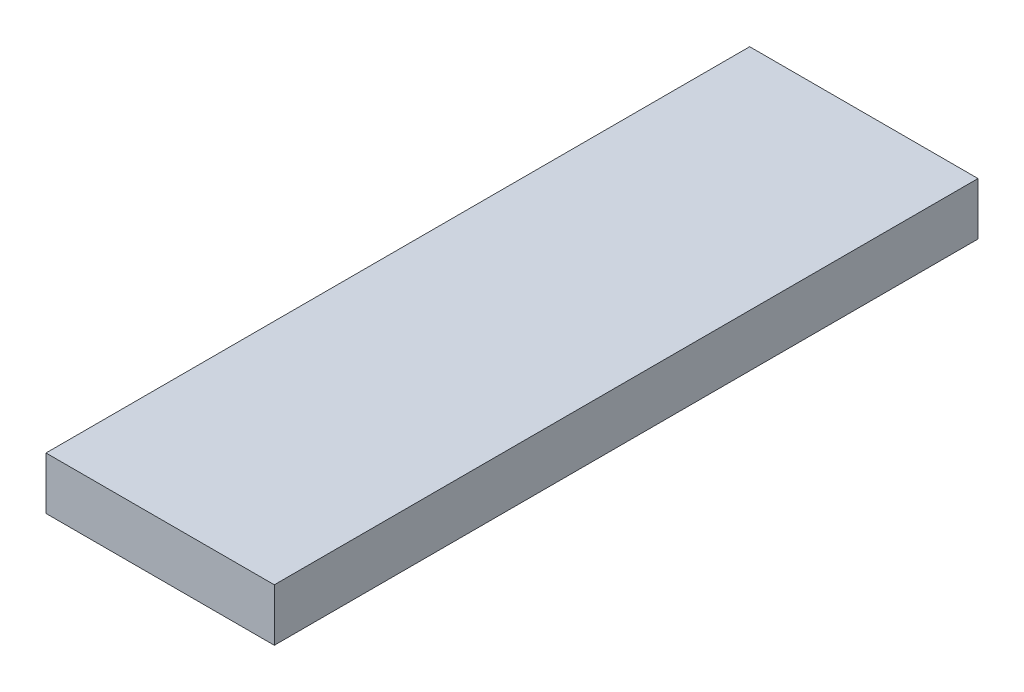
ISO-10303-21;
HEADER;
FILE_DESCRIPTION(('STEP AP214'),'2;1');
FILE_NAME('part.step','',(''),(''),'','','');
FILE_SCHEMA(('AUTOMOTIVE_DESIGN { 1 0 10303 214 1 1 1 1 }'));
ENDSEC;
DATA;
#1=APPLICATION_CONTEXT('core data for automotive mechanical design processes');
#2=APPLICATION_PROTOCOL_DEFINITION('international standard','automotive_design',2000,#1);
#3=PRODUCT_CONTEXT('',#1,'mechanical');
#4=PRODUCT('Part','Part','',(#3));
#5=PRODUCT_RELATED_PRODUCT_CATEGORY('part','',(#4));
#6=PRODUCT_DEFINITION_FORMATION('','',#4);
#7=PRODUCT_DEFINITION_CONTEXT('part definition',#1,'design');
#8=PRODUCT_DEFINITION('design','',#6,#7);
#9=PRODUCT_DEFINITION_SHAPE('','',#8);
#10=(LENGTH_UNIT() NAMED_UNIT(*) SI_UNIT(.MILLI.,.METRE.));
#11=(NAMED_UNIT(*) PLANE_ANGLE_UNIT() SI_UNIT($,.RADIAN.));
#12=(NAMED_UNIT(*) SI_UNIT($,.STERADIAN.) SOLID_ANGLE_UNIT());
#13=UNCERTAINTY_MEASURE_WITH_UNIT(LENGTH_MEASURE(1.E-05),#10,'distance_accuracy_value','');
#14=(GEOMETRIC_REPRESENTATION_CONTEXT(3) GLOBAL_UNCERTAINTY_ASSIGNED_CONTEXT((#13)) GLOBAL_UNIT_ASSIGNED_CONTEXT((#10,
#11,#12)) REPRESENTATION_CONTEXT('',''));
#15=CARTESIAN_POINT('',(0.,0.,0.));
#16=DIRECTION('',(0.,0.,1.));
#17=DIRECTION('',(1.,0.,0.));
#18=AXIS2_PLACEMENT_3D('',#15,#16,#17);
#19=CARTESIAN_POINT('',(193.675,88.9,-596.9));
#20=DIRECTION('',(-1.,0.,0.));
#21=DIRECTION('',(0.,0.,1.));
#22=AXIS2_PLACEMENT_3D('',#19,#20,#21);
#23=PLANE('',#22);
#24=DIRECTION('',(0.,0.,-1.));
#25=VECTOR('',#24,1.);
#26=CARTESIAN_POINT('',(193.675,0.,-596.9));
#27=LINE('',#26,#25);
#28=CARTESIAN_POINT('',(193.675,0.,596.9));
#29=VERTEX_POINT('',#28);
#30=CARTESIAN_POINT('',(193.675,0.,-596.9));
#31=VERTEX_POINT('',#30);
#32=EDGE_CURVE('E96',#29,#31,#27,.T.);
#33=ORIENTED_EDGE('',*,*,#32,.T.);
#34=DIRECTION('',(0.,-1.,0.));
#35=VECTOR('',#34,1.);
#36=CARTESIAN_POINT('',(193.675,88.9,-596.9));
#37=LINE('',#36,#35);
#38=CARTESIAN_POINT('',(193.675,88.9,-596.9));
#39=VERTEX_POINT('',#38);
#40=EDGE_CURVE('E11',#39,#31,#37,.T.);
#41=ORIENTED_EDGE('',*,*,#40,.F.);
#42=DIRECTION('',(0.,0.,-1.));
#43=VECTOR('',#42,1.);
#44=CARTESIAN_POINT('',(193.675,88.9,-596.9));
#45=LINE('',#44,#43);
#46=CARTESIAN_POINT('',(193.675,88.9,596.9));
#47=VERTEX_POINT('',#46);
#48=EDGE_CURVE('E84',#47,#39,#45,.T.);
#49=ORIENTED_EDGE('',*,*,#48,.F.);
#50=DIRECTION('',(0.,-1.,0.));
#51=VECTOR('',#50,1.);
#52=CARTESIAN_POINT('',(193.675,88.9,596.9));
#53=LINE('',#52,#51);
#54=EDGE_CURVE('E92',#47,#29,#53,.T.);
#55=ORIENTED_EDGE('',*,*,#54,.T.);
#56=EDGE_LOOP('',(#33,#41,#49,#55));
#57=FACE_BOUND('',#56,.T.);
#58=ADVANCED_FACE('F33',(#57),#23,.F.);
#59=CARTESIAN_POINT('',(-193.675,88.9,-596.9));
#60=DIRECTION('',(0.,0.,1.));
#61=DIRECTION('',(1.,0.,0.));
#62=AXIS2_PLACEMENT_3D('',#59,#60,#61);
#63=PLANE('',#62);
#64=DIRECTION('',(-1.,0.,0.));
#65=VECTOR('',#64,1.);
#66=CARTESIAN_POINT('',(-193.675,0.,-596.9));
#67=LINE('',#66,#65);
#68=CARTESIAN_POINT('',(-193.675,0.,-596.9));
#69=VERTEX_POINT('',#68);
#70=EDGE_CURVE('E88',#31,#69,#67,.T.);
#71=ORIENTED_EDGE('',*,*,#70,.T.);
#72=DIRECTION('',(0.,-1.,0.));
#73=VECTOR('',#72,1.);
#74=CARTESIAN_POINT('',(-193.675,88.9,-596.9));
#75=LINE('',#74,#73);
#76=CARTESIAN_POINT('',(-193.675,88.9,-596.9));
#77=VERTEX_POINT('',#76);
#78=EDGE_CURVE('E41',#77,#69,#75,.T.);
#79=ORIENTED_EDGE('',*,*,#78,.F.);
#80=DIRECTION('',(-1.,0.,0.));
#81=VECTOR('',#80,1.);
#82=CARTESIAN_POINT('',(-193.675,88.9,-596.9));
#83=LINE('',#82,#81);
#84=EDGE_CURVE('E79',#39,#77,#83,.T.);
#85=ORIENTED_EDGE('',*,*,#84,.F.);
#86=ORIENTED_EDGE('',*,*,#40,.T.);
#87=EDGE_LOOP('',(#71,#79,#85,#86));
#88=FACE_BOUND('',#87,.T.);
#89=ADVANCED_FACE('F87',(#88),#63,.F.);
#90=CARTESIAN_POINT('',(-193.675,88.9,-596.9));
#91=DIRECTION('',(1.,0.,0.));
#92=DIRECTION('',(0.,0.,-1.));
#93=AXIS2_PLACEMENT_3D('',#90,#91,#92);
#94=PLANE('',#93);
#95=DIRECTION('',(0.,0.,1.));
#96=VECTOR('',#95,1.);
#97=CARTESIAN_POINT('',(-193.675,0.,-596.9));
#98=LINE('',#97,#96);
#99=CARTESIAN_POINT('',(-193.675,0.,596.9));
#100=VERTEX_POINT('',#99);
#101=EDGE_CURVE('E66',#69,#100,#98,.T.);
#102=ORIENTED_EDGE('',*,*,#101,.T.);
#103=DIRECTION('',(0.,-1.,0.));
#104=VECTOR('',#103,1.);
#105=CARTESIAN_POINT('',(-193.675,88.9,596.9));
#106=LINE('',#105,#104);
#107=CARTESIAN_POINT('',(-193.675,88.9,596.9));
#108=VERTEX_POINT('',#107);
#109=EDGE_CURVE('E89',#108,#100,#106,.T.);
#110=ORIENTED_EDGE('',*,*,#109,.F.);
#111=DIRECTION('',(0.,0.,1.));
#112=VECTOR('',#111,1.);
#113=CARTESIAN_POINT('',(-193.675,88.9,-596.9));
#114=LINE('',#113,#112);
#115=EDGE_CURVE('E82',#77,#108,#114,.T.);
#116=ORIENTED_EDGE('',*,*,#115,.F.);
#117=ORIENTED_EDGE('',*,*,#78,.T.);
#118=EDGE_LOOP('',(#102,#110,#116,#117));
#119=FACE_BOUND('',#118,.T.);
#120=ADVANCED_FACE('F90',(#119),#94,.F.);
#121=CARTESIAN_POINT('',(-193.675,88.9,596.9));
#122=DIRECTION('',(0.,0.,-1.));
#123=DIRECTION('',(-1.,0.,0.));
#124=AXIS2_PLACEMENT_3D('',#121,#122,#123);
#125=PLANE('',#124);
#126=DIRECTION('',(1.,0.,0.));
#127=VECTOR('',#126,1.);
#128=CARTESIAN_POINT('',(-193.675,0.,596.9));
#129=LINE('',#128,#127);
#130=EDGE_CURVE('E72',#100,#29,#129,.T.);
#131=ORIENTED_EDGE('',*,*,#130,.T.);
#132=ORIENTED_EDGE('',*,*,#54,.F.);
#133=DIRECTION('',(1.,0.,0.));
#134=VECTOR('',#133,1.);
#135=CARTESIAN_POINT('',(-193.675,88.9,596.9));
#136=LINE('',#135,#134);
#137=EDGE_CURVE('E49',#108,#47,#136,.T.);
#138=ORIENTED_EDGE('',*,*,#137,.F.);
#139=ORIENTED_EDGE('',*,*,#109,.T.);
#140=EDGE_LOOP('',(#131,#132,#138,#139));
#141=FACE_BOUND('',#140,.T.);
#142=ADVANCED_FACE('F103',(#141),#125,.F.);
#143=CARTESIAN_POINT('',(0.,88.9,0.));
#144=DIRECTION('',(0.,1.,0.));
#145=DIRECTION('',(0.,0.,1.));
#146=AXIS2_PLACEMENT_3D('',#143,#144,#145);
#147=PLANE('',#146);
#148=ORIENTED_EDGE('',*,*,#48,.T.);
#149=ORIENTED_EDGE('',*,*,#84,.T.);
#150=ORIENTED_EDGE('',*,*,#115,.T.);
#151=ORIENTED_EDGE('',*,*,#137,.T.);
#152=EDGE_LOOP('',(#148,#149,#150,#151));
#153=FACE_BOUND('',#152,.T.);
#154=ADVANCED_FACE('F80',(#153),#147,.T.);
#155=CARTESIAN_POINT('',(0.,0.,0.));
#156=DIRECTION('',(0.,1.,0.));
#157=DIRECTION('',(0.,0.,1.));
#158=AXIS2_PLACEMENT_3D('',#155,#156,#157);
#159=PLANE('',#158);
#160=ORIENTED_EDGE('',*,*,#32,.F.);
#161=ORIENTED_EDGE('',*,*,#130,.F.);
#162=ORIENTED_EDGE('',*,*,#101,.F.);
#163=ORIENTED_EDGE('',*,*,#70,.F.);
#164=EDGE_LOOP('',(#160,#161,#162,#163));
#165=FACE_BOUND('',#164,.T.);
#166=ADVANCED_FACE('F106',(#165),#159,.F.);
#167=CLOSED_SHELL('',(#58,#89,#120,#142,#154,#166));
#168=MANIFOLD_SOLID_BREP('B2',#167);
#169=ADVANCED_BREP_SHAPE_REPRESENTATION('',(#18,#168),#14);
#170=SHAPE_DEFINITION_REPRESENTATION(#9,#169);
ENDSEC;
END-ISO-10303-21;
